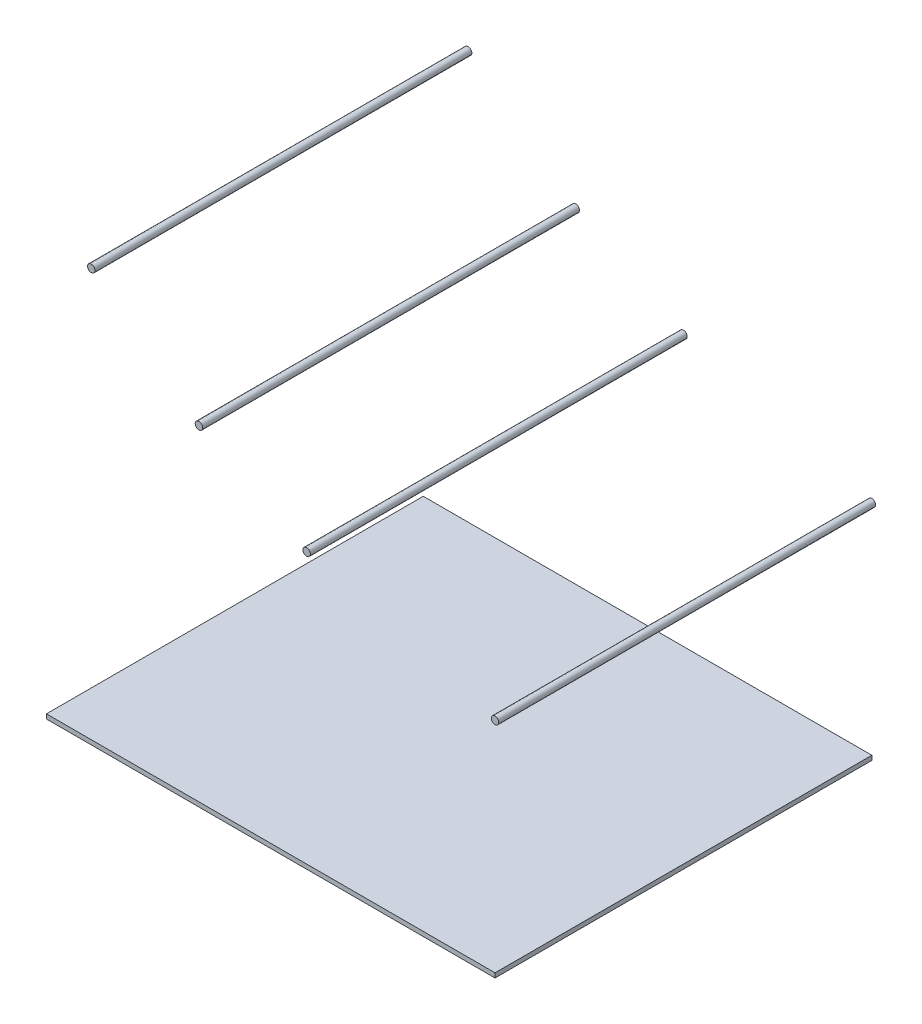
ISO-10303-21;
HEADER;
FILE_DESCRIPTION(('STEP AP214'),'2;1');
FILE_NAME('part.step','',(''),(''),'','','');
FILE_SCHEMA(('AUTOMOTIVE_DESIGN { 1 0 10303 214 1 1 1 1 }'));
ENDSEC;
DATA;
#1=APPLICATION_CONTEXT('core data for automotive mechanical design processes');
#2=APPLICATION_PROTOCOL_DEFINITION('international standard','automotive_design',2000,#1);
#3=PRODUCT_CONTEXT('',#1,'mechanical');
#4=PRODUCT('Part','Part','',(#3));
#5=PRODUCT_RELATED_PRODUCT_CATEGORY('part','',(#4));
#6=PRODUCT_DEFINITION_FORMATION('','',#4);
#7=PRODUCT_DEFINITION_CONTEXT('part definition',#1,'design');
#8=PRODUCT_DEFINITION('design','',#6,#7);
#9=PRODUCT_DEFINITION_SHAPE('','',#8);
#10=(LENGTH_UNIT() NAMED_UNIT(*) SI_UNIT(.MILLI.,.METRE.));
#11=(NAMED_UNIT(*) PLANE_ANGLE_UNIT() SI_UNIT($,.RADIAN.));
#12=(NAMED_UNIT(*) SI_UNIT($,.STERADIAN.) SOLID_ANGLE_UNIT());
#13=UNCERTAINTY_MEASURE_WITH_UNIT(LENGTH_MEASURE(1.E-05),#10,'distance_accuracy_value','');
#14=(GEOMETRIC_REPRESENTATION_CONTEXT(3) GLOBAL_UNCERTAINTY_ASSIGNED_CONTEXT((#13)) GLOBAL_UNIT_ASSIGNED_CONTEXT((#10,
#11,#12)) REPRESENTATION_CONTEXT('',''));
#15=CARTESIAN_POINT('',(0.,0.,0.));
#16=DIRECTION('',(0.,0.,1.));
#17=DIRECTION('',(1.,0.,0.));
#18=AXIS2_PLACEMENT_3D('',#15,#16,#17);
#19=CARTESIAN_POINT('',(0.,0.,1066.8));
#20=DIRECTION('',(-1.,0.,0.));
#21=DIRECTION('',(0.,-1.,0.));
#22=AXIS2_PLACEMENT_3D('',#19,#20,#21);
#23=PLANE('',#22);
#24=DIRECTION('',(0.,1.,0.));
#25=VECTOR('',#24,1.);
#26=CARTESIAN_POINT('',(0.,0.,-1066.8));
#27=LINE('',#26,#25);
#28=CARTESIAN_POINT('',(0.,-25.4,-1066.8));
#29=VERTEX_POINT('',#28);
#30=CARTESIAN_POINT('',(0.,0.,-1066.8));
#31=VERTEX_POINT('',#30);
#32=EDGE_CURVE('E109',#29,#31,#27,.T.);
#33=ORIENTED_EDGE('',*,*,#32,.T.);
#34=DIRECTION('',(0.,0.,-1.));
#35=VECTOR('',#34,1.);
#36=CARTESIAN_POINT('',(0.,0.,1066.8));
#37=LINE('',#36,#35);
#38=CARTESIAN_POINT('',(0.,0.,1066.8));
#39=VERTEX_POINT('',#38);
#40=EDGE_CURVE('E12',#39,#31,#37,.T.);
#41=ORIENTED_EDGE('',*,*,#40,.F.);
#42=DIRECTION('',(0.,1.,0.));
#43=VECTOR('',#42,1.);
#44=CARTESIAN_POINT('',(0.,0.,1066.8));
#45=LINE('',#44,#43);
#46=CARTESIAN_POINT('',(0.,-25.4,1066.8));
#47=VERTEX_POINT('',#46);
#48=EDGE_CURVE('E97',#47,#39,#45,.T.);
#49=ORIENTED_EDGE('',*,*,#48,.F.);
#50=DIRECTION('',(0.,0.,-1.));
#51=VECTOR('',#50,1.);
#52=CARTESIAN_POINT('',(0.,-25.4,1066.8));
#53=LINE('',#52,#51);
#54=EDGE_CURVE('E105',#47,#29,#53,.T.);
#55=ORIENTED_EDGE('',*,*,#54,.T.);
#56=EDGE_LOOP('',(#33,#41,#49,#55));
#57=FACE_BOUND('',#56,.T.);
#58=ADVANCED_FACE('F46',(#57),#23,.F.);
#59=CARTESIAN_POINT('',(0.,0.,1066.8));
#60=DIRECTION('',(0.,-1.,0.));
#61=DIRECTION('',(1.,0.,0.));
#62=AXIS2_PLACEMENT_3D('',#59,#60,#61);
#63=PLANE('',#62);
#64=DIRECTION('',(-1.,0.,0.));
#65=VECTOR('',#64,1.);
#66=CARTESIAN_POINT('',(0.,0.,-1066.8));
#67=LINE('',#66,#65);
#68=CARTESIAN_POINT('',(-2540.,-3.11060286983428E-13,-1066.8));
#69=VERTEX_POINT('',#68);
#70=EDGE_CURVE('E101',#31,#69,#67,.T.);
#71=ORIENTED_EDGE('',*,*,#70,.T.);
#72=DIRECTION('',(0.,0.,-1.));
#73=VECTOR('',#72,1.);
#74=CARTESIAN_POINT('',(-2540.,-3.11060286983428E-13,1066.8));
#75=LINE('',#74,#73);
#76=CARTESIAN_POINT('',(-2540.,-3.11060286983428E-13,1066.8));
#77=VERTEX_POINT('',#76);
#78=EDGE_CURVE('E54',#77,#69,#75,.T.);
#79=ORIENTED_EDGE('',*,*,#78,.F.);
#80=DIRECTION('',(-1.,0.,0.));
#81=VECTOR('',#80,1.);
#82=CARTESIAN_POINT('',(0.,0.,1066.8));
#83=LINE('',#82,#81);
#84=EDGE_CURVE('E92',#39,#77,#83,.T.);
#85=ORIENTED_EDGE('',*,*,#84,.F.);
#86=ORIENTED_EDGE('',*,*,#40,.T.);
#87=EDGE_LOOP('',(#71,#79,#85,#86));
#88=FACE_BOUND('',#87,.T.);
#89=ADVANCED_FACE('F100',(#88),#63,.F.);
#90=CARTESIAN_POINT('',(-2540.,-3.11060286983428E-13,1066.8));
#91=DIRECTION('',(1.,0.,0.));
#92=DIRECTION('',(0.,0.,-1.));
#93=AXIS2_PLACEMENT_3D('',#90,#91,#92);
#94=PLANE('',#93);
#95=DIRECTION('',(0.,-1.,0.));
#96=VECTOR('',#95,1.);
#97=CARTESIAN_POINT('',(-2540.,-3.11060286983428E-13,-1066.8));
#98=LINE('',#97,#96);
#99=CARTESIAN_POINT('',(-2540.,-25.4000000000003,-1066.8));
#100=VERTEX_POINT('',#99);
#101=EDGE_CURVE('E79',#69,#100,#98,.T.);
#102=ORIENTED_EDGE('',*,*,#101,.T.);
#103=DIRECTION('',(0.,0.,-1.));
#104=VECTOR('',#103,1.);
#105=CARTESIAN_POINT('',(-2540.,-25.4000000000003,1066.8));
#106=LINE('',#105,#104);
#107=CARTESIAN_POINT('',(-2540.,-25.4000000000003,1066.8));
#108=VERTEX_POINT('',#107);
#109=EDGE_CURVE('E102',#108,#100,#106,.T.);
#110=ORIENTED_EDGE('',*,*,#109,.F.);
#111=DIRECTION('',(0.,-1.,0.));
#112=VECTOR('',#111,1.);
#113=CARTESIAN_POINT('',(-2540.,-3.11060286983428E-13,1066.8));
#114=LINE('',#113,#112);
#115=EDGE_CURVE('E95',#77,#108,#114,.T.);
#116=ORIENTED_EDGE('',*,*,#115,.F.);
#117=ORIENTED_EDGE('',*,*,#78,.T.);
#118=EDGE_LOOP('',(#102,#110,#116,#117));
#119=FACE_BOUND('',#118,.T.);
#120=ADVANCED_FACE('F103',(#119),#94,.F.);
#121=CARTESIAN_POINT('',(0.,-25.4,1066.8));
#122=DIRECTION('',(0.,1.,0.));
#123=DIRECTION('',(-1.,0.,0.));
#124=AXIS2_PLACEMENT_3D('',#121,#122,#123);
#125=PLANE('',#124);
#126=DIRECTION('',(1.,0.,0.));
#127=VECTOR('',#126,1.);
#128=CARTESIAN_POINT('',(0.,-25.4,-1066.8));
#129=LINE('',#128,#127);
#130=EDGE_CURVE('E85',#100,#29,#129,.T.);
#131=ORIENTED_EDGE('',*,*,#130,.T.);
#132=ORIENTED_EDGE('',*,*,#54,.F.);
#133=DIRECTION('',(1.,0.,0.));
#134=VECTOR('',#133,1.);
#135=CARTESIAN_POINT('',(0.,-25.4,1066.8));
#136=LINE('',#135,#134);
#137=EDGE_CURVE('E62',#108,#47,#136,.T.);
#138=ORIENTED_EDGE('',*,*,#137,.F.);
#139=ORIENTED_EDGE('',*,*,#109,.T.);
#140=EDGE_LOOP('',(#131,#132,#138,#139));
#141=FACE_BOUND('',#140,.T.);
#142=ADVANCED_FACE('F118',(#141),#125,.F.);
#143=CARTESIAN_POINT('',(0.,0.,1066.8));
#144=DIRECTION('',(0.,0.,-1.));
#145=DIRECTION('',(-1.,0.,0.));
#146=AXIS2_PLACEMENT_3D('',#143,#144,#145);
#147=PLANE('',#146);
#148=ORIENTED_EDGE('',*,*,#48,.T.);
#149=ORIENTED_EDGE('',*,*,#84,.T.);
#150=ORIENTED_EDGE('',*,*,#115,.T.);
#151=ORIENTED_EDGE('',*,*,#137,.T.);
#152=EDGE_LOOP('',(#148,#149,#150,#151));
#153=FACE_BOUND('',#152,.T.);
#154=ADVANCED_FACE('F93',(#153),#147,.F.);
#155=CARTESIAN_POINT('',(0.,0.,-1066.8));
#156=DIRECTION('',(0.,0.,-1.));
#157=DIRECTION('',(-1.,0.,0.));
#158=AXIS2_PLACEMENT_3D('',#155,#156,#157);
#159=PLANE('',#158);
#160=ORIENTED_EDGE('',*,*,#32,.F.);
#161=ORIENTED_EDGE('',*,*,#130,.F.);
#162=ORIENTED_EDGE('',*,*,#101,.F.);
#163=ORIENTED_EDGE('',*,*,#70,.F.);
#164=EDGE_LOOP('',(#160,#161,#162,#163));
#165=FACE_BOUND('',#164,.T.);
#166=ADVANCED_FACE('F121',(#165),#159,.T.);
#167=CLOSED_SHELL('',(#58,#89,#120,#142,#154,#166));
#168=MANIFOLD_SOLID_BREP('B2',#167);
#169=CARTESIAN_POINT('',(-2286.,2311.4,1066.8));
#170=DIRECTION('',(0.,0.,-1.));
#171=DIRECTION('',(-1.,0.,0.));
#172=AXIS2_PLACEMENT_3D('',#169,#170,#171);
#173=CYLINDRICAL_SURFACE('',#172,21.0819999999999);
#174=CARTESIAN_POINT('',(-2286.,2311.4,1066.8));
#175=DIRECTION('',(0.,0.,1.));
#176=DIRECTION('',(1.,0.,0.));
#177=AXIS2_PLACEMENT_3D('',#174,#175,#176);
#178=CIRCLE('',#177,21.0819999999999);
#179=CARTESIAN_POINT('',(-2264.918,2311.4,1066.8));
#180=VERTEX_POINT('',#179);
#181=EDGE_CURVE('E45',#180,#180,#178,.T.);
#182=ORIENTED_EDGE('',*,*,#181,.F.);
#183=EDGE_LOOP('',(#182));
#184=FACE_BOUND('',#183,.T.);
#185=CARTESIAN_POINT('',(-2286.,2311.4,-1066.8));
#186=DIRECTION('',(0.,0.,1.));
#187=DIRECTION('',(1.,0.,0.));
#188=AXIS2_PLACEMENT_3D('',#185,#186,#187);
#189=CIRCLE('',#188,21.0819999999999);
#190=CARTESIAN_POINT('',(-2264.918,2311.4,-1066.8));
#191=VERTEX_POINT('',#190);
#192=EDGE_CURVE('E185',#191,#191,#189,.T.);
#193=ORIENTED_EDGE('',*,*,#192,.T.);
#194=EDGE_LOOP('',(#193));
#195=FACE_BOUND('',#194,.T.);
#196=ADVANCED_FACE('F182',(#184,#195),#173,.T.);
#197=CARTESIAN_POINT('',(-2286.,2311.4,1066.8));
#198=DIRECTION('',(0.,0.,1.));
#199=DIRECTION('',(1.,0.,0.));
#200=AXIS2_PLACEMENT_3D('',#197,#198,#199);
#201=PLANE('',#200);
#202=ORIENTED_EDGE('',*,*,#181,.T.);
#203=EDGE_LOOP('',(#202));
#204=FACE_BOUND('',#203,.T.);
#205=ADVANCED_FACE('F197',(#204),#201,.T.);
#206=CARTESIAN_POINT('',(-2286.,2311.4,-1066.8));
#207=DIRECTION('',(0.,0.,1.));
#208=DIRECTION('',(1.,0.,0.));
#209=AXIS2_PLACEMENT_3D('',#206,#207,#208);
#210=PLANE('',#209);
#211=ORIENTED_EDGE('',*,*,#192,.F.);
#212=EDGE_LOOP('',(#211));
#213=FACE_BOUND('',#212,.T.);
#214=ADVANCED_FACE('F195',(#213),#210,.F.);
#215=CLOSED_SHELL('',(#196,#205,#214));
#216=MANIFOLD_SOLID_BREP('B6',#215);
#217=CARTESIAN_POINT('',(-1676.4,1844.675,1066.8));
#218=DIRECTION('',(0.,0.,-1.));
#219=DIRECTION('',(-1.,0.,0.));
#220=AXIS2_PLACEMENT_3D('',#217,#218,#219);
#221=CYLINDRICAL_SURFACE('',#220,21.0819999999998);
#222=CARTESIAN_POINT('',(-1676.4,1844.675,1066.8));
#223=DIRECTION('',(0.,0.,1.));
#224=DIRECTION('',(1.,0.,0.));
#225=AXIS2_PLACEMENT_3D('',#222,#223,#224);
#226=CIRCLE('',#225,21.0819999999998);
#227=CARTESIAN_POINT('',(-1655.318,1844.675,1066.8));
#228=VERTEX_POINT('',#227);
#229=EDGE_CURVE('E181',#228,#228,#226,.T.);
#230=ORIENTED_EDGE('',*,*,#229,.F.);
#231=EDGE_LOOP('',(#230));
#232=FACE_BOUND('',#231,.T.);
#233=CARTESIAN_POINT('',(-1676.4,1844.675,-1066.8));
#234=DIRECTION('',(0.,0.,1.));
#235=DIRECTION('',(1.,0.,0.));
#236=AXIS2_PLACEMENT_3D('',#233,#234,#235);
#237=CIRCLE('',#236,21.0819999999998);
#238=CARTESIAN_POINT('',(-1655.318,1844.675,-1066.8));
#239=VERTEX_POINT('',#238);
#240=EDGE_CURVE('E234',#239,#239,#237,.T.);
#241=ORIENTED_EDGE('',*,*,#240,.T.);
#242=EDGE_LOOP('',(#241));
#243=FACE_BOUND('',#242,.T.);
#244=ADVANCED_FACE('F231',(#232,#243),#221,.T.);
#245=CARTESIAN_POINT('',(-1676.4,1844.675,1066.8));
#246=DIRECTION('',(0.,0.,1.));
#247=DIRECTION('',(1.,0.,0.));
#248=AXIS2_PLACEMENT_3D('',#245,#246,#247);
#249=PLANE('',#248);
#250=ORIENTED_EDGE('',*,*,#229,.T.);
#251=EDGE_LOOP('',(#250));
#252=FACE_BOUND('',#251,.T.);
#253=ADVANCED_FACE('F246',(#252),#249,.T.);
#254=CARTESIAN_POINT('',(-1676.4,1844.675,-1066.8));
#255=DIRECTION('',(0.,0.,1.));
#256=DIRECTION('',(1.,0.,0.));
#257=AXIS2_PLACEMENT_3D('',#254,#255,#256);
#258=PLANE('',#257);
#259=ORIENTED_EDGE('',*,*,#240,.F.);
#260=EDGE_LOOP('',(#259));
#261=FACE_BOUND('',#260,.T.);
#262=ADVANCED_FACE('F244',(#261),#258,.F.);
#263=CLOSED_SHELL('',(#244,#253,#262));
#264=MANIFOLD_SOLID_BREP('B40',#263);
#265=CARTESIAN_POINT('',(-1066.8,1530.35,1066.8));
#266=DIRECTION('',(0.,0.,-1.));
#267=DIRECTION('',(-1.,0.,0.));
#268=AXIS2_PLACEMENT_3D('',#265,#266,#267);
#269=CYLINDRICAL_SURFACE('',#268,21.0819999999998);
#270=CARTESIAN_POINT('',(-1066.8,1530.35,1066.8));
#271=DIRECTION('',(0.,0.,1.));
#272=DIRECTION('',(1.,0.,0.));
#273=AXIS2_PLACEMENT_3D('',#270,#271,#272);
#274=CIRCLE('',#273,21.0819999999998);
#275=CARTESIAN_POINT('',(-1045.718,1530.35,1066.8));
#276=VERTEX_POINT('',#275);
#277=EDGE_CURVE('E230',#276,#276,#274,.T.);
#278=ORIENTED_EDGE('',*,*,#277,.F.);
#279=EDGE_LOOP('',(#278));
#280=FACE_BOUND('',#279,.T.);
#281=CARTESIAN_POINT('',(-1066.8,1530.35,-1066.8));
#282=DIRECTION('',(0.,0.,1.));
#283=DIRECTION('',(1.,0.,0.));
#284=AXIS2_PLACEMENT_3D('',#281,#282,#283);
#285=CIRCLE('',#284,21.0819999999998);
#286=CARTESIAN_POINT('',(-1045.718,1530.35,-1066.8));
#287=VERTEX_POINT('',#286);
#288=EDGE_CURVE('E282',#287,#287,#285,.T.);
#289=ORIENTED_EDGE('',*,*,#288,.T.);
#290=EDGE_LOOP('',(#289));
#291=FACE_BOUND('',#290,.T.);
#292=ADVANCED_FACE('F279',(#280,#291),#269,.T.);
#293=CARTESIAN_POINT('',(-1066.8,1530.35,1066.8));
#294=DIRECTION('',(0.,0.,1.));
#295=DIRECTION('',(1.,0.,0.));
#296=AXIS2_PLACEMENT_3D('',#293,#294,#295);
#297=PLANE('',#296);
#298=ORIENTED_EDGE('',*,*,#277,.T.);
#299=EDGE_LOOP('',(#298));
#300=FACE_BOUND('',#299,.T.);
#301=ADVANCED_FACE('F296',(#300),#297,.T.);
#302=CARTESIAN_POINT('',(-1066.8,1530.35,-1066.8));
#303=DIRECTION('',(0.,0.,1.));
#304=DIRECTION('',(1.,0.,0.));
#305=AXIS2_PLACEMENT_3D('',#302,#303,#304);
#306=PLANE('',#305);
#307=ORIENTED_EDGE('',*,*,#288,.F.);
#308=EDGE_LOOP('',(#307));
#309=FACE_BOUND('',#308,.T.);
#310=ADVANCED_FACE('F294',(#309),#306,.F.);
#311=CLOSED_SHELL('',(#292,#301,#310));
#312=MANIFOLD_SOLID_BREP('B176',#311);
#313=CARTESIAN_POINT('',(0.,1238.25,1066.8));
#314=DIRECTION('',(0.,0.,-1.));
#315=DIRECTION('',(-1.,0.,0.));
#316=AXIS2_PLACEMENT_3D('',#313,#314,#315);
#317=CYLINDRICAL_SURFACE('',#316,21.082);
#318=CARTESIAN_POINT('',(0.,1238.25,1066.8));
#319=DIRECTION('',(0.,0.,1.));
#320=DIRECTION('',(1.,0.,0.));
#321=AXIS2_PLACEMENT_3D('',#318,#319,#320);
#322=CIRCLE('',#321,21.082);
#323=CARTESIAN_POINT('',(21.082,1238.25,1066.8));
#324=VERTEX_POINT('',#323);
#325=EDGE_CURVE('E278',#324,#324,#322,.T.);
#326=ORIENTED_EDGE('',*,*,#325,.F.);
#327=EDGE_LOOP('',(#326));
#328=FACE_BOUND('',#327,.T.);
#329=CARTESIAN_POINT('',(0.,1238.25,-1066.8));
#330=DIRECTION('',(0.,0.,1.));
#331=DIRECTION('',(1.,0.,0.));
#332=AXIS2_PLACEMENT_3D('',#329,#330,#331);
#333=CIRCLE('',#332,21.082);
#334=CARTESIAN_POINT('',(21.082,1238.25,-1066.8));
#335=VERTEX_POINT('',#334);
#336=EDGE_CURVE('E326',#335,#335,#333,.T.);
#337=ORIENTED_EDGE('',*,*,#336,.T.);
#338=EDGE_LOOP('',(#337));
#339=FACE_BOUND('',#338,.T.);
#340=ADVANCED_FACE('F323',(#328,#339),#317,.T.);
#341=CARTESIAN_POINT('',(0.,1238.25,1066.8));
#342=DIRECTION('',(0.,0.,1.));
#343=DIRECTION('',(1.,0.,0.));
#344=AXIS2_PLACEMENT_3D('',#341,#342,#343);
#345=PLANE('',#344);
#346=ORIENTED_EDGE('',*,*,#325,.T.);
#347=EDGE_LOOP('',(#346));
#348=FACE_BOUND('',#347,.T.);
#349=ADVANCED_FACE('F338',(#348),#345,.T.);
#350=CARTESIAN_POINT('',(0.,1238.25,-1066.8));
#351=DIRECTION('',(0.,0.,1.));
#352=DIRECTION('',(1.,0.,0.));
#353=AXIS2_PLACEMENT_3D('',#350,#351,#352);
#354=PLANE('',#353);
#355=ORIENTED_EDGE('',*,*,#336,.F.);
#356=EDGE_LOOP('',(#355));
#357=FACE_BOUND('',#356,.T.);
#358=ADVANCED_FACE('F336',(#357),#354,.F.);
#359=CLOSED_SHELL('',(#340,#349,#358));
#360=MANIFOLD_SOLID_BREP('B225',#359);
#361=ADVANCED_BREP_SHAPE_REPRESENTATION('',(#18,#168,#216,#264,#312,#360),#14);
#362=SHAPE_DEFINITION_REPRESENTATION(#9,#361);
ENDSEC;
END-ISO-10303-21;
